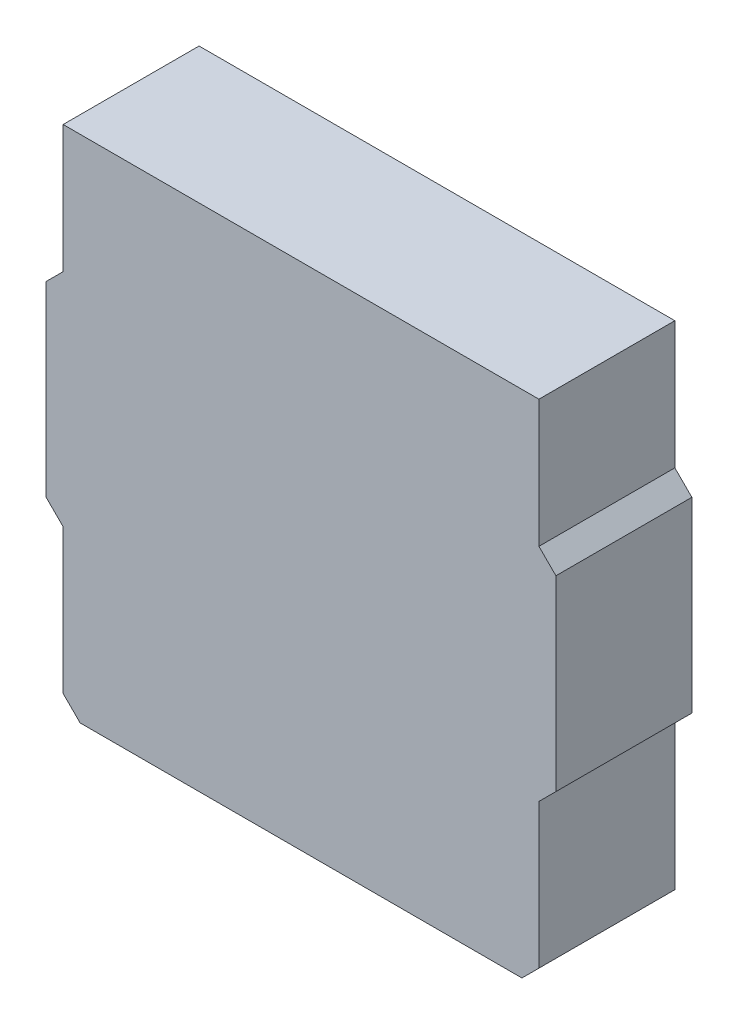
ISO-10303-21;
HEADER;
FILE_DESCRIPTION(('STEP AP214'),'2;1');
FILE_NAME('part.step','',(''),(''),'','','');
FILE_SCHEMA(('AUTOMOTIVE_DESIGN { 1 0 10303 214 1 1 1 1 }'));
ENDSEC;
DATA;
#1=APPLICATION_CONTEXT('core data for automotive mechanical design processes');
#2=APPLICATION_PROTOCOL_DEFINITION('international standard','automotive_design',2000,#1);
#3=PRODUCT_CONTEXT('',#1,'mechanical');
#4=PRODUCT('Part','Part','',(#3));
#5=PRODUCT_RELATED_PRODUCT_CATEGORY('part','',(#4));
#6=PRODUCT_DEFINITION_FORMATION('','',#4);
#7=PRODUCT_DEFINITION_CONTEXT('part definition',#1,'design');
#8=PRODUCT_DEFINITION('design','',#6,#7);
#9=PRODUCT_DEFINITION_SHAPE('','',#8);
#10=(LENGTH_UNIT() NAMED_UNIT(*) SI_UNIT(.MILLI.,.METRE.));
#11=(NAMED_UNIT(*) PLANE_ANGLE_UNIT() SI_UNIT($,.RADIAN.));
#12=(NAMED_UNIT(*) SI_UNIT($,.STERADIAN.) SOLID_ANGLE_UNIT());
#13=UNCERTAINTY_MEASURE_WITH_UNIT(LENGTH_MEASURE(1.E-05),#10,'distance_accuracy_value','');
#14=(GEOMETRIC_REPRESENTATION_CONTEXT(3) GLOBAL_UNCERTAINTY_ASSIGNED_CONTEXT((#13)) GLOBAL_UNIT_ASSIGNED_CONTEXT((#10,
#11,#12)) REPRESENTATION_CONTEXT('',''));
#15=CARTESIAN_POINT('',(0.,0.,0.));
#16=DIRECTION('',(0.,0.,1.));
#17=DIRECTION('',(1.,0.,0.));
#18=AXIS2_PLACEMENT_3D('',#15,#16,#17);
#19=CARTESIAN_POINT('',(7.00000124,-7.00000124,0.));
#20=DIRECTION('',(0.707106781186548,-0.707106781186548,0.));
#21=DIRECTION('',(0.707106781186548,0.707106781186548,0.));
#22=AXIS2_PLACEMENT_3D('',#19,#20,#21);
#23=PLANE('',#22);
#24=DIRECTION('',(0.,0.,-1.));
#25=VECTOR('',#24,1.);
#26=CARTESIAN_POINT('',(6.50000224,-7.50000024,0.));
#27=LINE('',#26,#25);
#28=CARTESIAN_POINT('',(6.50000224,-7.50000024,0.));
#29=VERTEX_POINT('',#28);
#30=CARTESIAN_POINT('',(6.50000224,-7.50000024,3.99999962));
#31=VERTEX_POINT('',#30);
#32=EDGE_CURVE('E121',#29,#31,#27,.F.);
#33=ORIENTED_EDGE('',*,*,#32,.F.);
#34=DIRECTION('',(0.707106781186548,0.707106781186548,0.));
#35=VECTOR('',#34,1.);
#36=CARTESIAN_POINT('',(7.00000124,-7.00000124,0.));
#37=LINE('',#36,#35);
#38=CARTESIAN_POINT('',(7.00000251,-7.000000605,0.));
#39=VERTEX_POINT('',#38);
#40=EDGE_CURVE('E19',#29,#39,#37,.T.);
#41=ORIENTED_EDGE('',*,*,#40,.T.);
#42=DIRECTION('',(0.,0.,-1.));
#43=VECTOR('',#42,1.);
#44=CARTESIAN_POINT('',(7.00000378,-7.00000124,0.));
#45=LINE('',#44,#43);
#46=CARTESIAN_POINT('',(7.000003145,-6.99999997,3.99999962));
#47=VERTEX_POINT('',#46);
#48=EDGE_CURVE('E134',#47,#39,#45,.T.);
#49=ORIENTED_EDGE('',*,*,#48,.F.);
#50=DIRECTION('',(0.707106781186547,0.707106781186547,0.));
#51=VECTOR('',#50,1.);
#52=CARTESIAN_POINT('',(6.50000224,-7.50000024,3.99999962));
#53=LINE('',#52,#51);
#54=EDGE_CURVE('E132',#31,#47,#53,.T.);
#55=ORIENTED_EDGE('',*,*,#54,.F.);
#56=EDGE_LOOP('',(#33,#41,#49,#55));
#57=FACE_BOUND('',#56,.T.);
#58=ADVANCED_FACE('F16',(#57),#23,.T.);
#59=CARTESIAN_POINT('',(7.50000278,-2.24999804,0.));
#60=DIRECTION('',(0.707108577234767,-0.707104985133767,0.));
#61=DIRECTION('',(0.707104985133767,0.707108577234767,0.));
#62=AXIS2_PLACEMENT_3D('',#59,#60,#61);
#63=PLANE('',#62);
#64=DIRECTION('',(0.,0.,-1.));
#65=VECTOR('',#64,1.);
#66=CARTESIAN_POINT('',(7.00000378,-2.74999958,0.));
#67=LINE('',#66,#65);
#68=CARTESIAN_POINT('',(7.00000378000009,-2.74999958000009,0.));
#69=VERTEX_POINT('',#68);
#70=CARTESIAN_POINT('',(7.00000378000009,-2.74999958000009,3.99999962));
#71=VERTEX_POINT('',#70);
#72=EDGE_CURVE('E142',#69,#71,#67,.F.);
#73=ORIENTED_EDGE('',*,*,#72,.F.);
#74=DIRECTION('',(0.707104985133767,0.707108577234767,0.));
#75=VECTOR('',#74,1.);
#76=CARTESIAN_POINT('',(7.50000278,-2.24999804,0.));
#77=LINE('',#76,#75);
#78=CARTESIAN_POINT('',(7.50000278,-2.24999804,0.));
#79=VERTEX_POINT('',#78);
#80=EDGE_CURVE('E159',#69,#79,#77,.T.);
#81=ORIENTED_EDGE('',*,*,#80,.T.);
#82=DIRECTION('',(0.,0.,-1.));
#83=VECTOR('',#82,1.);
#84=CARTESIAN_POINT('',(7.50000278,-2.24999804,0.));
#85=LINE('',#84,#83);
#86=CARTESIAN_POINT('',(7.50000278,-2.24999804,3.99999962));
#87=VERTEX_POINT('',#86);
#88=EDGE_CURVE('E214',#87,#79,#85,.T.);
#89=ORIENTED_EDGE('',*,*,#88,.F.);
#90=DIRECTION('',(0.70710498513401,0.707108577234523,0.));
#91=VECTOR('',#90,1.);
#92=CARTESIAN_POINT('',(7.00000378,-2.74999958,3.99999962));
#93=LINE('',#92,#91);
#94=EDGE_CURVE('E137',#71,#87,#93,.T.);
#95=ORIENTED_EDGE('',*,*,#94,.F.);
#96=EDGE_LOOP('',(#73,#81,#89,#95));
#97=FACE_BOUND('',#96,.T.);
#98=ADVANCED_FACE('F221',(#97),#63,.T.);
#99=CARTESIAN_POINT('',(7.00000378,3.75000012,0.));
#100=DIRECTION('',(0.707108577234767,0.707104985133767,0.));
#101=DIRECTION('',(-0.707104985133767,0.707108577234767,0.));
#102=AXIS2_PLACEMENT_3D('',#99,#100,#101);
#103=PLANE('',#102);
#104=DIRECTION('',(0.,0.,-1.));
#105=VECTOR('',#104,1.);
#106=CARTESIAN_POINT('',(7.50000278,3.24999858,0.));
#107=LINE('',#106,#105);
#108=CARTESIAN_POINT('',(7.50000277999991,3.24999857999991,0.));
#109=VERTEX_POINT('',#108);
#110=CARTESIAN_POINT('',(7.50000277999991,3.24999857999991,3.99999962));
#111=VERTEX_POINT('',#110);
#112=EDGE_CURVE('E170',#109,#111,#107,.F.);
#113=ORIENTED_EDGE('',*,*,#112,.F.);
#114=DIRECTION('',(-0.707104985133767,0.707108577234767,0.));
#115=VECTOR('',#114,1.);
#116=CARTESIAN_POINT('',(7.00000378,3.75000012,0.));
#117=LINE('',#116,#115);
#118=CARTESIAN_POINT('',(7.00000378,3.75000012,0.));
#119=VERTEX_POINT('',#118);
#120=EDGE_CURVE('E158',#109,#119,#117,.T.);
#121=ORIENTED_EDGE('',*,*,#120,.T.);
#122=DIRECTION('',(0.,0.,-1.));
#123=VECTOR('',#122,1.);
#124=CARTESIAN_POINT('',(7.00000378,3.75000012,0.));
#125=LINE('',#124,#123);
#126=CARTESIAN_POINT('',(7.00000378,3.75000012,3.99999962));
#127=VERTEX_POINT('',#126);
#128=EDGE_CURVE('E208',#127,#119,#125,.T.);
#129=ORIENTED_EDGE('',*,*,#128,.F.);
#130=DIRECTION('',(-0.70710498513401,0.707108577234524,0.));
#131=VECTOR('',#130,1.);
#132=CARTESIAN_POINT('',(7.50000278,3.24999858,3.99999962));
#133=LINE('',#132,#131);
#134=EDGE_CURVE('E152',#111,#127,#133,.T.);
#135=ORIENTED_EDGE('',*,*,#134,.F.);
#136=EDGE_LOOP('',(#113,#121,#129,#135));
#137=FACE_BOUND('',#136,.T.);
#138=ADVANCED_FACE('F229',(#137),#103,.T.);
#139=CARTESIAN_POINT('',(-7.50000024,3.24999858,0.));
#140=DIRECTION('',(-0.707106781186548,0.707106781186548,0.));
#141=DIRECTION('',(-0.707106781186548,-0.707106781186548,0.));
#142=AXIS2_PLACEMENT_3D('',#139,#140,#141);
#143=PLANE('',#142);
#144=DIRECTION('',(0.,0.,1.));
#145=VECTOR('',#144,1.);
#146=CARTESIAN_POINT('',(-6.9999987,3.75000012,0.));
#147=LINE('',#146,#145);
#148=CARTESIAN_POINT('',(-6.9999987,3.75000012,0.));
#149=VERTEX_POINT('',#148);
#150=CARTESIAN_POINT('',(-6.9999987,3.75000012,3.99999962));
#151=VERTEX_POINT('',#150);
#152=EDGE_CURVE('E202',#149,#151,#147,.T.);
#153=ORIENTED_EDGE('',*,*,#152,.F.);
#154=DIRECTION('',(-0.707106781186548,-0.707106781186548,0.));
#155=VECTOR('',#154,1.);
#156=CARTESIAN_POINT('',(-7.50000024,3.24999858,0.));
#157=LINE('',#156,#155);
#158=CARTESIAN_POINT('',(-7.50000024,3.24999858,0.));
#159=VERTEX_POINT('',#158);
#160=EDGE_CURVE('E156',#149,#159,#157,.T.);
#161=ORIENTED_EDGE('',*,*,#160,.T.);
#162=DIRECTION('',(0.,0.,1.));
#163=VECTOR('',#162,1.);
#164=CARTESIAN_POINT('',(-7.50000024,3.24999858,0.));
#165=LINE('',#164,#163);
#166=CARTESIAN_POINT('',(-7.50000024,3.24999858,3.99999962));
#167=VERTEX_POINT('',#166);
#168=EDGE_CURVE('E189',#167,#159,#165,.F.);
#169=ORIENTED_EDGE('',*,*,#168,.F.);
#170=DIRECTION('',(-0.707106781186547,-0.707106781186548,0.));
#171=VECTOR('',#170,1.);
#172=CARTESIAN_POINT('',(-6.9999987,3.75000012,3.99999962));
#173=LINE('',#172,#171);
#174=EDGE_CURVE('E150',#151,#167,#173,.T.);
#175=ORIENTED_EDGE('',*,*,#174,.F.);
#176=EDGE_LOOP('',(#153,#161,#169,#175));
#177=FACE_BOUND('',#176,.T.);
#178=ADVANCED_FACE('F264',(#177),#143,.T.);
#179=CARTESIAN_POINT('',(-6.4999997,-7.50000024,0.));
#180=DIRECTION('',(-0.707106781186548,-0.707106781186548,0.));
#181=DIRECTION('',(0.707106781186548,-0.707106781186548,0.));
#182=AXIS2_PLACEMENT_3D('',#179,#180,#181);
#183=PLANE('',#182);
#184=DIRECTION('',(0.,0.,1.));
#185=VECTOR('',#184,1.);
#186=CARTESIAN_POINT('',(-6.9999987,-7.00000124,0.));
#187=LINE('',#186,#185);
#188=CARTESIAN_POINT('',(-6.9999987,-7.00000124,0.));
#189=VERTEX_POINT('',#188);
#190=CARTESIAN_POINT('',(-6.9999987,-7.00000124,3.99999962));
#191=VERTEX_POINT('',#190);
#192=EDGE_CURVE('E187',#189,#191,#187,.T.);
#193=ORIENTED_EDGE('',*,*,#192,.F.);
#194=DIRECTION('',(0.707106781186548,-0.707106781186548,0.));
#195=VECTOR('',#194,1.);
#196=CARTESIAN_POINT('',(-6.4999997,-7.50000024,0.));
#197=LINE('',#196,#195);
#198=CARTESIAN_POINT('',(-6.4999997,-7.50000024,0.));
#199=VERTEX_POINT('',#198);
#200=EDGE_CURVE('E34',#189,#199,#197,.T.);
#201=ORIENTED_EDGE('',*,*,#200,.T.);
#202=DIRECTION('',(0.,0.,-1.));
#203=VECTOR('',#202,1.);
#204=CARTESIAN_POINT('',(-6.4999997,-7.50000024,0.));
#205=LINE('',#204,#203);
#206=CARTESIAN_POINT('',(-6.4999997,-7.50000024,3.99999962));
#207=VERTEX_POINT('',#206);
#208=EDGE_CURVE('E140',#207,#199,#205,.T.);
#209=ORIENTED_EDGE('',*,*,#208,.F.);
#210=DIRECTION('',(0.707106781186547,-0.707106781186548,0.));
#211=VECTOR('',#210,1.);
#212=CARTESIAN_POINT('',(-6.9999987,-7.00000124,3.99999962));
#213=LINE('',#212,#211);
#214=EDGE_CURVE('E115',#191,#207,#213,.T.);
#215=ORIENTED_EDGE('',*,*,#214,.F.);
#216=EDGE_LOOP('',(#193,#201,#209,#215));
#217=FACE_BOUND('',#216,.T.);
#218=ADVANCED_FACE('F287',(#217),#183,.T.);
#219=CARTESIAN_POINT('',(-6.4999997,-7.50000024,3.99999962));
#220=DIRECTION('',(0.,0.,1.));
#221=DIRECTION('',(1.,0.,0.));
#222=AXIS2_PLACEMENT_3D('',#219,#220,#221);
#223=PLANE('',#222);
#224=DIRECTION('',(0.,1.,0.));
#225=VECTOR('',#224,1.);
#226=CARTESIAN_POINT('',(-6.9999987,-7.00000124,3.99999962));
#227=LINE('',#226,#225);
#228=CARTESIAN_POINT('',(-6.9999987,-2.74999958,3.99999962));
#229=VERTEX_POINT('',#228);
#230=EDGE_CURVE('E185',#191,#229,#227,.T.);
#231=ORIENTED_EDGE('',*,*,#230,.F.);
#232=ORIENTED_EDGE('',*,*,#214,.T.);
#233=DIRECTION('',(1.,0.,0.));
#234=VECTOR('',#233,1.);
#235=CARTESIAN_POINT('',(6.50000224,-7.50000024,3.99999962));
#236=LINE('',#235,#234);
#237=EDGE_CURVE('E125',#31,#207,#236,.F.);
#238=ORIENTED_EDGE('',*,*,#237,.F.);
#239=ORIENTED_EDGE('',*,*,#54,.T.);
#240=DIRECTION('',(0.,1.,0.));
#241=VECTOR('',#240,1.);
#242=CARTESIAN_POINT('',(7.00000378,-2.74999958,3.99999962));
#243=LINE('',#242,#241);
#244=EDGE_CURVE('E169',#71,#47,#243,.F.);
#245=ORIENTED_EDGE('',*,*,#244,.F.);
#246=ORIENTED_EDGE('',*,*,#94,.T.);
#247=DIRECTION('',(0.,1.,0.));
#248=VECTOR('',#247,1.);
#249=CARTESIAN_POINT('',(7.50000278,3.24999858,3.99999962));
#250=LINE('',#249,#248);
#251=EDGE_CURVE('E216',#111,#87,#250,.F.);
#252=ORIENTED_EDGE('',*,*,#251,.F.);
#253=ORIENTED_EDGE('',*,*,#134,.T.);
#254=DIRECTION('',(0.,1.,0.));
#255=VECTOR('',#254,1.);
#256=CARTESIAN_POINT('',(7.00000378,7.50000024,3.99999962));
#257=LINE('',#256,#255);
#258=CARTESIAN_POINT('',(7.00000378,7.50000024,3.99999962));
#259=VERTEX_POINT('',#258);
#260=EDGE_CURVE('E211',#259,#127,#257,.F.);
#261=ORIENTED_EDGE('',*,*,#260,.F.);
#262=DIRECTION('',(1.,0.,0.));
#263=VECTOR('',#262,1.);
#264=CARTESIAN_POINT('',(-6.9999987,7.50000024,3.99999962));
#265=LINE('',#264,#263);
#266=CARTESIAN_POINT('',(-6.9999987,7.50000024,3.99999962));
#267=VERTEX_POINT('',#266);
#268=EDGE_CURVE('E206',#267,#259,#265,.T.);
#269=ORIENTED_EDGE('',*,*,#268,.F.);
#270=DIRECTION('',(0.,1.,0.));
#271=VECTOR('',#270,1.);
#272=CARTESIAN_POINT('',(-6.9999987,3.75000012,3.99999962));
#273=LINE('',#272,#271);
#274=EDGE_CURVE('E200',#151,#267,#273,.T.);
#275=ORIENTED_EDGE('',*,*,#274,.F.);
#276=ORIENTED_EDGE('',*,*,#174,.T.);
#277=DIRECTION('',(4.61818465080651E-07,-0.999999999999893,0.));
#278=VECTOR('',#277,1.);
#279=CARTESIAN_POINT('',(-7.4999977,-2.24999804,3.99999962));
#280=LINE('',#279,#278);
#281=CARTESIAN_POINT('',(-7.49999833499991,-2.24999740499669,3.99999962));
#282=VERTEX_POINT('',#281);
#283=EDGE_CURVE('E192',#282,#167,#280,.F.);
#284=ORIENTED_EDGE('',*,*,#283,.F.);
#285=DIRECTION('',(0.707104985133767,-0.707108577234767,0.));
#286=VECTOR('',#285,1.);
#287=CARTESIAN_POINT('',(-6.9999987,-2.74999958,3.99999962));
#288=LINE('',#287,#286);
#289=EDGE_CURVE('E147',#229,#282,#288,.F.);
#290=ORIENTED_EDGE('',*,*,#289,.F.);
#291=EDGE_LOOP('',(#231,#232,#238,#239,#245,#246,#252,#253,#261,#269,#275,#276,#284,#290));
#292=FACE_BOUND('',#291,.T.);
#293=ADVANCED_FACE('F139',(#292),#223,.T.);
#294=CARTESIAN_POINT('',(-6.9999987,-2.74999958,0.));
#295=DIRECTION('',(-0.707108577234767,-0.707104985133767,0.));
#296=DIRECTION('',(0.707104985133767,-0.707108577234767,0.));
#297=AXIS2_PLACEMENT_3D('',#294,#295,#296);
#298=PLANE('',#297);
#299=DIRECTION('',(0.,0.,1.));
#300=VECTOR('',#299,1.);
#301=CARTESIAN_POINT('',(-7.4999977,-2.24999804,0.));
#302=LINE('',#301,#300);
#303=CARTESIAN_POINT('',(-7.49999833499991,-2.24999740499669,0.));
#304=VERTEX_POINT('',#303);
#305=EDGE_CURVE('E195',#304,#282,#302,.T.);
#306=ORIENTED_EDGE('',*,*,#305,.F.);
#307=DIRECTION('',(0.707104985133767,-0.707108577234767,0.));
#308=VECTOR('',#307,1.);
#309=CARTESIAN_POINT('',(-6.9999987,-2.74999958,0.));
#310=LINE('',#309,#308);
#311=CARTESIAN_POINT('',(-6.9999987,-2.74999958,0.));
#312=VERTEX_POINT('',#311);
#313=EDGE_CURVE('E129',#304,#312,#310,.T.);
#314=ORIENTED_EDGE('',*,*,#313,.T.);
#315=DIRECTION('',(0.,0.,1.));
#316=VECTOR('',#315,1.);
#317=CARTESIAN_POINT('',(-6.9999987,-2.74999958,0.));
#318=LINE('',#317,#316);
#319=EDGE_CURVE('E179',#229,#312,#318,.F.);
#320=ORIENTED_EDGE('',*,*,#319,.F.);
#321=ORIENTED_EDGE('',*,*,#289,.T.);
#322=EDGE_LOOP('',(#306,#314,#320,#321));
#323=FACE_BOUND('',#322,.T.);
#324=ADVANCED_FACE('F259',(#323),#298,.T.);
#325=CARTESIAN_POINT('',(6.50000224,-7.50000024,0.));
#326=DIRECTION('',(0.,-1.,0.));
#327=DIRECTION('',(0.,0.,-1.));
#328=AXIS2_PLACEMENT_3D('',#325,#326,#327);
#329=PLANE('',#328);
#330=ORIENTED_EDGE('',*,*,#208,.T.);
#331=DIRECTION('',(1.,0.,0.));
#332=VECTOR('',#331,1.);
#333=CARTESIAN_POINT('',(-6.4999997,-7.50000024,0.));
#334=LINE('',#333,#332);
#335=EDGE_CURVE('E127',#199,#29,#334,.T.);
#336=ORIENTED_EDGE('',*,*,#335,.T.);
#337=ORIENTED_EDGE('',*,*,#32,.T.);
#338=ORIENTED_EDGE('',*,*,#237,.T.);
#339=EDGE_LOOP('',(#330,#336,#337,#338));
#340=FACE_BOUND('',#339,.T.);
#341=ADVANCED_FACE('F124',(#340),#329,.T.);
#342=CARTESIAN_POINT('',(7.00000378,-2.74999958,0.));
#343=DIRECTION('',(1.,0.,0.));
#344=DIRECTION('',(0.,0.,-1.));
#345=AXIS2_PLACEMENT_3D('',#342,#343,#344);
#346=PLANE('',#345);
#347=ORIENTED_EDGE('',*,*,#48,.T.);
#348=DIRECTION('',(0.,1.,0.));
#349=VECTOR('',#348,1.);
#350=CARTESIAN_POINT('',(7.00000378,-7.50000024,0.));
#351=LINE('',#350,#349);
#352=EDGE_CURVE('E168',#39,#69,#351,.T.);
#353=ORIENTED_EDGE('',*,*,#352,.T.);
#354=ORIENTED_EDGE('',*,*,#72,.T.);
#355=ORIENTED_EDGE('',*,*,#244,.T.);
#356=EDGE_LOOP('',(#347,#353,#354,#355));
#357=FACE_BOUND('',#356,.T.);
#358=ADVANCED_FACE('F167',(#357),#346,.T.);
#359=CARTESIAN_POINT('',(7.50000278,3.24999858,0.));
#360=DIRECTION('',(1.,0.,0.));
#361=DIRECTION('',(0.,0.,-1.));
#362=AXIS2_PLACEMENT_3D('',#359,#360,#361);
#363=PLANE('',#362);
#364=ORIENTED_EDGE('',*,*,#88,.T.);
#365=DIRECTION('',(0.,1.,0.));
#366=VECTOR('',#365,1.);
#367=CARTESIAN_POINT('',(7.50000278,-7.50000024,0.));
#368=LINE('',#367,#366);
#369=EDGE_CURVE('E174',#79,#109,#368,.T.);
#370=ORIENTED_EDGE('',*,*,#369,.T.);
#371=ORIENTED_EDGE('',*,*,#112,.T.);
#372=ORIENTED_EDGE('',*,*,#251,.T.);
#373=EDGE_LOOP('',(#364,#370,#371,#372));
#374=FACE_BOUND('',#373,.T.);
#375=ADVANCED_FACE('F224',(#374),#363,.T.);
#376=CARTESIAN_POINT('',(7.00000378,7.50000024,0.));
#377=DIRECTION('',(1.,0.,0.));
#378=DIRECTION('',(0.,0.,-1.));
#379=AXIS2_PLACEMENT_3D('',#376,#377,#378);
#380=PLANE('',#379);
#381=ORIENTED_EDGE('',*,*,#128,.T.);
#382=DIRECTION('',(0.,1.,0.));
#383=VECTOR('',#382,1.);
#384=CARTESIAN_POINT('',(7.00000378,-7.50000024,0.));
#385=LINE('',#384,#383);
#386=CARTESIAN_POINT('',(7.00000378,7.50000024,0.));
#387=VERTEX_POINT('',#386);
#388=EDGE_CURVE('E177',#119,#387,#385,.T.);
#389=ORIENTED_EDGE('',*,*,#388,.T.);
#390=DIRECTION('',(0.,0.,1.));
#391=VECTOR('',#390,1.);
#392=CARTESIAN_POINT('',(7.00000378,7.50000024,0.));
#393=LINE('',#392,#391);
#394=EDGE_CURVE('E204',#259,#387,#393,.F.);
#395=ORIENTED_EDGE('',*,*,#394,.F.);
#396=ORIENTED_EDGE('',*,*,#260,.T.);
#397=EDGE_LOOP('',(#381,#389,#395,#396));
#398=FACE_BOUND('',#397,.T.);
#399=ADVANCED_FACE('F234',(#398),#380,.T.);
#400=CARTESIAN_POINT('',(-6.9999987,7.50000024,0.));
#401=DIRECTION('',(0.,1.,0.));
#402=DIRECTION('',(0.,0.,1.));
#403=AXIS2_PLACEMENT_3D('',#400,#401,#402);
#404=PLANE('',#403);
#405=ORIENTED_EDGE('',*,*,#394,.T.);
#406=DIRECTION('',(1.,0.,0.));
#407=VECTOR('',#406,1.);
#408=CARTESIAN_POINT('',(-6.4999997,7.50000024,0.));
#409=LINE('',#408,#407);
#410=CARTESIAN_POINT('',(-6.9999987,7.50000024,0.));
#411=VERTEX_POINT('',#410);
#412=EDGE_CURVE('E242',#387,#411,#409,.F.);
#413=ORIENTED_EDGE('',*,*,#412,.T.);
#414=DIRECTION('',(0.,0.,1.));
#415=VECTOR('',#414,1.);
#416=CARTESIAN_POINT('',(-6.9999987,7.50000024,0.));
#417=LINE('',#416,#415);
#418=EDGE_CURVE('E198',#267,#411,#417,.F.);
#419=ORIENTED_EDGE('',*,*,#418,.F.);
#420=ORIENTED_EDGE('',*,*,#268,.T.);
#421=EDGE_LOOP('',(#405,#413,#419,#420));
#422=FACE_BOUND('',#421,.T.);
#423=ADVANCED_FACE('F240',(#422),#404,.T.);
#424=CARTESIAN_POINT('',(-6.9999987,3.75000012,0.));
#425=DIRECTION('',(-1.,0.,0.));
#426=DIRECTION('',(0.,0.,1.));
#427=AXIS2_PLACEMENT_3D('',#424,#425,#426);
#428=PLANE('',#427);
#429=ORIENTED_EDGE('',*,*,#418,.T.);
#430=DIRECTION('',(0.,1.,0.));
#431=VECTOR('',#430,1.);
#432=CARTESIAN_POINT('',(-6.9999987,-7.50000024,0.));
#433=LINE('',#432,#431);
#434=EDGE_CURVE('E245',#411,#149,#433,.F.);
#435=ORIENTED_EDGE('',*,*,#434,.T.);
#436=ORIENTED_EDGE('',*,*,#152,.T.);
#437=ORIENTED_EDGE('',*,*,#274,.T.);
#438=EDGE_LOOP('',(#429,#435,#436,#437));
#439=FACE_BOUND('',#438,.T.);
#440=ADVANCED_FACE('F266',(#439),#428,.T.);
#441=CARTESIAN_POINT('',(-7.4999977,-2.24999804,0.));
#442=DIRECTION('',(-0.999999999999893,-4.61818465080651E-07,0.));
#443=DIRECTION('',(4.61818465080651E-07,-0.999999999999893,0.));
#444=AXIS2_PLACEMENT_3D('',#441,#442,#443);
#445=PLANE('',#444);
#446=ORIENTED_EDGE('',*,*,#168,.T.);
#447=DIRECTION('',(0.,1.,0.));
#448=VECTOR('',#447,1.);
#449=CARTESIAN_POINT('',(-7.50000024,-7.50000024,0.));
#450=LINE('',#449,#448);
#451=EDGE_CURVE('E25',#159,#304,#450,.F.);
#452=ORIENTED_EDGE('',*,*,#451,.T.);
#453=ORIENTED_EDGE('',*,*,#305,.T.);
#454=ORIENTED_EDGE('',*,*,#283,.T.);
#455=EDGE_LOOP('',(#446,#452,#453,#454));
#456=FACE_BOUND('',#455,.T.);
#457=ADVANCED_FACE('F252',(#456),#445,.T.);
#458=CARTESIAN_POINT('',(-6.9999987,-7.00000124,0.));
#459=DIRECTION('',(-1.,0.,0.));
#460=DIRECTION('',(0.,0.,1.));
#461=AXIS2_PLACEMENT_3D('',#458,#459,#460);
#462=PLANE('',#461);
#463=ORIENTED_EDGE('',*,*,#319,.T.);
#464=DIRECTION('',(0.,1.,0.));
#465=VECTOR('',#464,1.);
#466=CARTESIAN_POINT('',(-6.9999987,-7.50000024,0.));
#467=LINE('',#466,#465);
#468=EDGE_CURVE('E10',#312,#189,#467,.F.);
#469=ORIENTED_EDGE('',*,*,#468,.T.);
#470=ORIENTED_EDGE('',*,*,#192,.T.);
#471=ORIENTED_EDGE('',*,*,#230,.T.);
#472=EDGE_LOOP('',(#463,#469,#470,#471));
#473=FACE_BOUND('',#472,.T.);
#474=ADVANCED_FACE('F274',(#473),#462,.T.);
#475=CARTESIAN_POINT('',(-6.4999997,-7.50000024,0.));
#476=DIRECTION('',(0.,0.,1.));
#477=DIRECTION('',(1.,0.,0.));
#478=AXIS2_PLACEMENT_3D('',#475,#476,#477);
#479=PLANE('',#478);
#480=ORIENTED_EDGE('',*,*,#468,.F.);
#481=ORIENTED_EDGE('',*,*,#313,.F.);
#482=ORIENTED_EDGE('',*,*,#451,.F.);
#483=ORIENTED_EDGE('',*,*,#160,.F.);
#484=ORIENTED_EDGE('',*,*,#434,.F.);
#485=ORIENTED_EDGE('',*,*,#412,.F.);
#486=ORIENTED_EDGE('',*,*,#388,.F.);
#487=ORIENTED_EDGE('',*,*,#120,.F.);
#488=ORIENTED_EDGE('',*,*,#369,.F.);
#489=ORIENTED_EDGE('',*,*,#80,.F.);
#490=ORIENTED_EDGE('',*,*,#352,.F.);
#491=ORIENTED_EDGE('',*,*,#40,.F.);
#492=ORIENTED_EDGE('',*,*,#335,.F.);
#493=ORIENTED_EDGE('',*,*,#200,.F.);
#494=EDGE_LOOP('',(#480,#481,#482,#483,#484,#485,#486,#487,#488,#489,#490,#491,#492,#493));
#495=FACE_BOUND('',#494,.T.);
#496=ADVANCED_FACE('F172',(#495),#479,.F.);
#497=CLOSED_SHELL('',(#58,#98,#138,#178,#218,#293,#324,#341,#358,#375,#399,#423,#440,#457,#474,#496));
#498=MANIFOLD_SOLID_BREP('B1',#497);
#499=ADVANCED_BREP_SHAPE_REPRESENTATION('',(#18,#498),#14);
#500=SHAPE_DEFINITION_REPRESENTATION(#9,#499);
ENDSEC;
END-ISO-10303-21;
